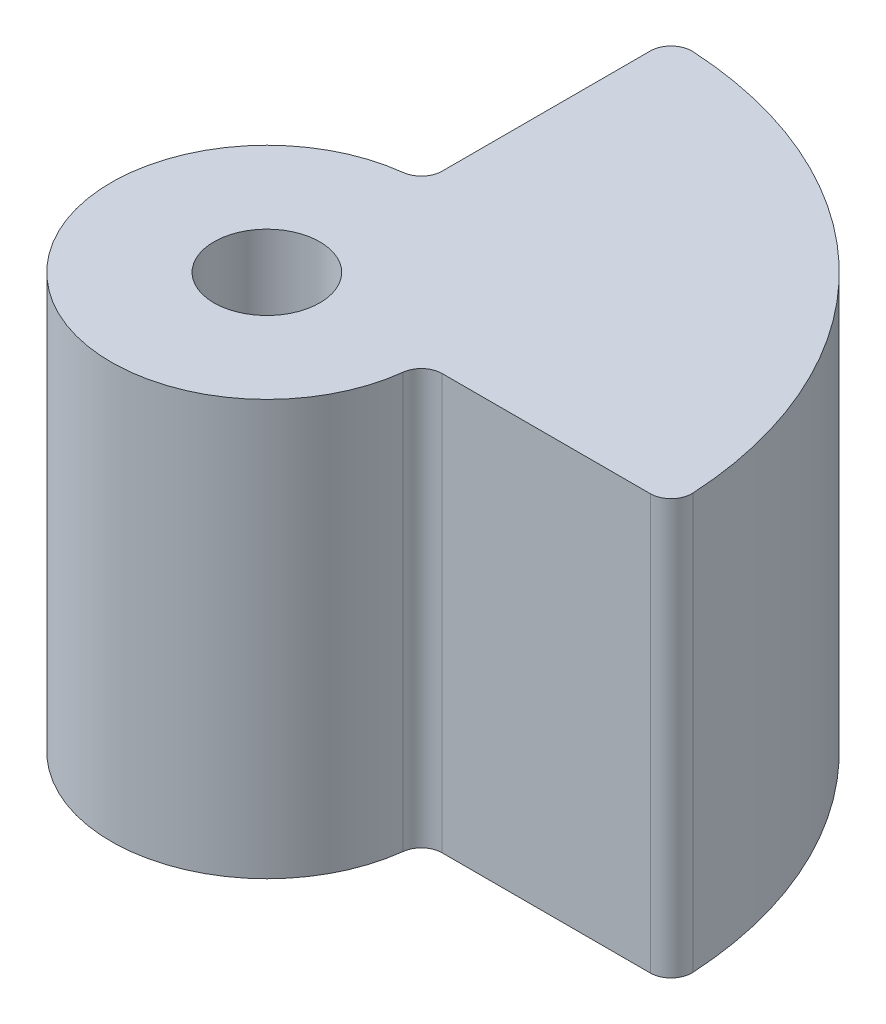
ISO-10303-21;
HEADER;
FILE_DESCRIPTION(('STEP AP214'),'2;1');
FILE_NAME('part.step','',(''),(''),'','','');
FILE_SCHEMA(('AUTOMOTIVE_DESIGN { 1 0 10303 214 1 1 1 1 }'));
ENDSEC;
DATA;
#1=APPLICATION_CONTEXT('core data for automotive mechanical design processes');
#2=APPLICATION_PROTOCOL_DEFINITION('international standard','automotive_design',2000,#1);
#3=PRODUCT_CONTEXT('',#1,'mechanical');
#4=PRODUCT('Part','Part','',(#3));
#5=PRODUCT_RELATED_PRODUCT_CATEGORY('part','',(#4));
#6=PRODUCT_DEFINITION_FORMATION('','',#4);
#7=PRODUCT_DEFINITION_CONTEXT('part definition',#1,'design');
#8=PRODUCT_DEFINITION('design','',#6,#7);
#9=PRODUCT_DEFINITION_SHAPE('','',#8);
#10=(LENGTH_UNIT() NAMED_UNIT(*) SI_UNIT(.MILLI.,.METRE.));
#11=(NAMED_UNIT(*) PLANE_ANGLE_UNIT() SI_UNIT($,.RADIAN.));
#12=(NAMED_UNIT(*) SI_UNIT($,.STERADIAN.) SOLID_ANGLE_UNIT());
#13=UNCERTAINTY_MEASURE_WITH_UNIT(LENGTH_MEASURE(1.E-05),#10,'distance_accuracy_value','');
#14=(GEOMETRIC_REPRESENTATION_CONTEXT(3) GLOBAL_UNCERTAINTY_ASSIGNED_CONTEXT((#13)) GLOBAL_UNIT_ASSIGNED_CONTEXT((#10,
#11,#12)) REPRESENTATION_CONTEXT('',''));
#15=CARTESIAN_POINT('',(0.,0.,0.));
#16=DIRECTION('',(0.,0.,1.));
#17=DIRECTION('',(1.,0.,0.));
#18=AXIS2_PLACEMENT_3D('',#15,#16,#17);
#19=CARTESIAN_POINT('',(0.,20.,0.));
#20=DIRECTION('',(0.,-1.,0.));
#21=DIRECTION('',(0.,0.,-1.));
#22=AXIS2_PLACEMENT_3D('',#19,#20,#21);
#23=CYLINDRICAL_SURFACE('',#22,7.5);
#24=CARTESIAN_POINT('',(0.,20.,0.));
#25=DIRECTION('',(0.,1.,0.));
#26=DIRECTION('',(0.,0.,1.));
#27=AXIS2_PLACEMENT_3D('',#24,#25,#26);
#28=CIRCLE('',#27,7.5);
#29=CARTESIAN_POINT('',(-0.882352941176471,20.,-7.44791603652976));
#30=VERTEX_POINT('',#29);
#31=CARTESIAN_POINT('',(7.44791603652976,20.,0.882352941176471));
#32=VERTEX_POINT('',#31);
#33=EDGE_CURVE('E134',#30,#32,#28,.T.);
#34=ORIENTED_EDGE('',*,*,#33,.F.);
#35=DIRECTION('',(0.,-1.,0.));
#36=VECTOR('',#35,1.);
#37=CARTESIAN_POINT('',(-0.882352941176471,20.,-7.44791603652976));
#38=LINE('',#37,#36);
#39=CARTESIAN_POINT('',(-0.882352941176471,0.,-7.44791603652976));
#40=VERTEX_POINT('',#39);
#41=EDGE_CURVE('E163',#30,#40,#38,.T.);
#42=ORIENTED_EDGE('',*,*,#41,.T.);
#43=CARTESIAN_POINT('',(0.,0.,0.));
#44=DIRECTION('',(0.,1.,0.));
#45=DIRECTION('',(0.,0.,1.));
#46=AXIS2_PLACEMENT_3D('',#43,#44,#45);
#47=CIRCLE('',#46,7.5);
#48=CARTESIAN_POINT('',(7.44791603652976,0.,0.882352941176471));
#49=VERTEX_POINT('',#48);
#50=EDGE_CURVE('E180',#40,#49,#47,.T.);
#51=ORIENTED_EDGE('',*,*,#50,.T.);
#52=DIRECTION('',(0.,-1.,0.));
#53=VECTOR('',#52,1.);
#54=CARTESIAN_POINT('',(7.44791603652976,20.,0.882352941176471));
#55=LINE('',#54,#53);
#56=EDGE_CURVE('E160',#49,#32,#55,.F.);
#57=ORIENTED_EDGE('',*,*,#56,.T.);
#58=EDGE_LOOP('',(#34,#42,#51,#57));
#59=FACE_BOUND('',#58,.T.);
#60=ADVANCED_FACE('F39',(#59),#23,.T.);
#61=CARTESIAN_POINT('',(7.5,20.,0.));
#62=DIRECTION('',(0.,0.,-1.));
#63=DIRECTION('',(-1.,0.,0.));
#64=AXIS2_PLACEMENT_3D('',#61,#62,#63);
#65=PLANE('',#64);
#66=DIRECTION('',(1.,0.,0.));
#67=VECTOR('',#66,1.);
#68=CARTESIAN_POINT('',(7.5,20.,0.));
#69=LINE('',#68,#67);
#70=CARTESIAN_POINT('',(8.44097150806707,20.,0.));
#71=VERTEX_POINT('',#70);
#72=CARTESIAN_POINT('',(18.4729532019112,20.,0.));
#73=VERTEX_POINT('',#72);
#74=EDGE_CURVE('E139',#71,#73,#69,.T.);
#75=ORIENTED_EDGE('',*,*,#74,.F.);
#76=DIRECTION('',(0.,1.,0.));
#77=VECTOR('',#76,1.);
#78=CARTESIAN_POINT('',(8.44097150806707,0.,0.));
#79=LINE('',#78,#77);
#80=CARTESIAN_POINT('',(8.44097150806707,0.,0.));
#81=VERTEX_POINT('',#80);
#82=EDGE_CURVE('E169',#71,#81,#79,.F.);
#83=ORIENTED_EDGE('',*,*,#82,.T.);
#84=DIRECTION('',(1.,0.,0.));
#85=VECTOR('',#84,1.);
#86=CARTESIAN_POINT('',(7.5,0.,0.));
#87=LINE('',#86,#85);
#88=CARTESIAN_POINT('',(18.4729532019112,0.,0.));
#89=VERTEX_POINT('',#88);
#90=EDGE_CURVE('E141',#81,#89,#87,.T.);
#91=ORIENTED_EDGE('',*,*,#90,.T.);
#92=DIRECTION('',(0.,-1.,0.));
#93=VECTOR('',#92,1.);
#94=CARTESIAN_POINT('',(18.4729532019112,20.,0.));
#95=LINE('',#94,#93);
#96=EDGE_CURVE('E55',#89,#73,#95,.F.);
#97=ORIENTED_EDGE('',*,*,#96,.T.);
#98=EDGE_LOOP('',(#75,#83,#91,#97));
#99=FACE_BOUND('',#98,.T.);
#100=ADVANCED_FACE('F191',(#99),#65,.F.);
#101=CARTESIAN_POINT('',(0.,20.,0.));
#102=DIRECTION('',(0.,-1.,0.));
#103=DIRECTION('',(0.,0.,-1.));
#104=AXIS2_PLACEMENT_3D('',#101,#102,#103);
#105=CYLINDRICAL_SURFACE('',#104,19.5);
#106=CARTESIAN_POINT('',(0.,0.,0.));
#107=DIRECTION('',(0.,1.,0.));
#108=DIRECTION('',(0.,0.,1.));
#109=AXIS2_PLACEMENT_3D('',#106,#107,#108);
#110=CIRCLE('',#109,19.5);
#111=CARTESIAN_POINT('',(19.4714912128253,0.,-1.05405405405405));
#112=VERTEX_POINT('',#111);
#113=CARTESIAN_POINT('',(1.05405405405405,0.,-19.4714912128253));
#114=VERTEX_POINT('',#113);
#115=EDGE_CURVE('E135',#112,#114,#110,.T.);
#116=ORIENTED_EDGE('',*,*,#115,.T.);
#117=DIRECTION('',(0.,-1.,0.));
#118=VECTOR('',#117,1.);
#119=CARTESIAN_POINT('',(1.05405405405405,20.,-19.4714912128253));
#120=LINE('',#119,#118);
#121=CARTESIAN_POINT('',(1.05405405405405,20.,-19.4714912128253));
#122=VERTEX_POINT('',#121);
#123=EDGE_CURVE('E110',#114,#122,#120,.F.);
#124=ORIENTED_EDGE('',*,*,#123,.T.);
#125=CARTESIAN_POINT('',(0.,20.,0.));
#126=DIRECTION('',(0.,1.,0.));
#127=DIRECTION('',(0.,0.,1.));
#128=AXIS2_PLACEMENT_3D('',#125,#126,#127);
#129=CIRCLE('',#128,19.5);
#130=CARTESIAN_POINT('',(19.4714912128253,20.,-1.05405405405405));
#131=VERTEX_POINT('',#130);
#132=EDGE_CURVE('E194',#131,#122,#129,.T.);
#133=ORIENTED_EDGE('',*,*,#132,.F.);
#134=DIRECTION('',(0.,-1.,0.));
#135=VECTOR('',#134,1.);
#136=CARTESIAN_POINT('',(19.4714912128253,20.,-1.05405405405405));
#137=LINE('',#136,#135);
#138=EDGE_CURVE('E116',#131,#112,#137,.T.);
#139=ORIENTED_EDGE('',*,*,#138,.T.);
#140=EDGE_LOOP('',(#116,#124,#133,#139));
#141=FACE_BOUND('',#140,.T.);
#142=ADVANCED_FACE('F219',(#141),#105,.T.);
#143=CARTESIAN_POINT('',(0.,20.,-7.5));
#144=DIRECTION('',(1.,0.,0.));
#145=DIRECTION('',(0.,0.,-1.));
#146=AXIS2_PLACEMENT_3D('',#143,#144,#145);
#147=PLANE('',#146);
#148=DIRECTION('',(0.,0.,1.));
#149=VECTOR('',#148,1.);
#150=CARTESIAN_POINT('',(0.,20.,-7.5));
#151=LINE('',#150,#149);
#152=CARTESIAN_POINT('',(0.,20.,-18.4729532019112));
#153=VERTEX_POINT('',#152);
#154=CARTESIAN_POINT('',(0.,20.,-8.44097150806707));
#155=VERTEX_POINT('',#154);
#156=EDGE_CURVE('E126',#153,#155,#151,.T.);
#157=ORIENTED_EDGE('',*,*,#156,.F.);
#158=DIRECTION('',(0.,-1.,0.));
#159=VECTOR('',#158,1.);
#160=CARTESIAN_POINT('',(0.,20.,-18.4729532019112));
#161=LINE('',#160,#159);
#162=CARTESIAN_POINT('',(0.,0.,-18.4729532019112));
#163=VERTEX_POINT('',#162);
#164=EDGE_CURVE('E109',#153,#163,#161,.T.);
#165=ORIENTED_EDGE('',*,*,#164,.T.);
#166=DIRECTION('',(0.,0.,1.));
#167=VECTOR('',#166,1.);
#168=CARTESIAN_POINT('',(0.,0.,-7.5));
#169=LINE('',#168,#167);
#170=CARTESIAN_POINT('',(0.,0.,-8.44097150806707));
#171=VERTEX_POINT('',#170);
#172=EDGE_CURVE('E123',#163,#171,#169,.T.);
#173=ORIENTED_EDGE('',*,*,#172,.T.);
#174=DIRECTION('',(0.,1.,0.));
#175=VECTOR('',#174,1.);
#176=CARTESIAN_POINT('',(0.,20.,-8.44097150806707));
#177=LINE('',#176,#175);
#178=EDGE_CURVE('E128',#171,#155,#177,.T.);
#179=ORIENTED_EDGE('',*,*,#178,.T.);
#180=EDGE_LOOP('',(#157,#165,#173,#179));
#181=FACE_BOUND('',#180,.T.);
#182=ADVANCED_FACE('F122',(#181),#147,.F.);
#183=CARTESIAN_POINT('',(0.,20.,0.));
#184=DIRECTION('',(0.,1.,0.));
#185=DIRECTION('',(0.,0.,1.));
#186=AXIS2_PLACEMENT_3D('',#183,#184,#185);
#187=PLANE('',#186);
#188=CARTESIAN_POINT('',(0.,20.,0.));
#189=DIRECTION('',(0.,1.,0.));
#190=DIRECTION('',(0.,0.,1.));
#191=AXIS2_PLACEMENT_3D('',#188,#189,#190);
#192=CIRCLE('',#191,2.55);
#193=CARTESIAN_POINT('',(0.,20.,2.55));
#194=VERTEX_POINT('',#193);
#195=EDGE_CURVE('E206',#194,#194,#192,.T.);
#196=ORIENTED_EDGE('',*,*,#195,.F.);
#197=EDGE_LOOP('',(#196));
#198=FACE_BOUND('',#197,.T.);
#199=ORIENTED_EDGE('',*,*,#132,.T.);
#200=CARTESIAN_POINT('',(1.,20.,-18.4729532019112));
#201=DIRECTION('',(0.,1.,0.));
#202=DIRECTION('',(0.,0.,1.));
#203=AXIS2_PLACEMENT_3D('',#200,#201,#202);
#204=CIRCLE('',#203,1.);
#205=EDGE_CURVE('E157',#122,#153,#204,.T.);
#206=ORIENTED_EDGE('',*,*,#205,.T.);
#207=ORIENTED_EDGE('',*,*,#156,.T.);
#208=CARTESIAN_POINT('',(-1.,20.,-8.44097150806707));
#209=DIRECTION('',(0.,1.,0.));
#210=DIRECTION('',(0.,0.,1.));
#211=AXIS2_PLACEMENT_3D('',#208,#209,#210);
#212=CIRCLE('',#211,1.);
#213=EDGE_CURVE('E175',#155,#30,#212,.F.);
#214=ORIENTED_EDGE('',*,*,#213,.T.);
#215=ORIENTED_EDGE('',*,*,#33,.T.);
#216=CARTESIAN_POINT('',(8.44097150806707,20.,1.));
#217=DIRECTION('',(0.,1.,0.));
#218=DIRECTION('',(0.,0.,1.));
#219=AXIS2_PLACEMENT_3D('',#216,#217,#218);
#220=CIRCLE('',#219,1.);
#221=EDGE_CURVE('E11',#32,#71,#220,.F.);
#222=ORIENTED_EDGE('',*,*,#221,.T.);
#223=ORIENTED_EDGE('',*,*,#74,.T.);
#224=CARTESIAN_POINT('',(18.4729532019112,20.,-1.));
#225=DIRECTION('',(0.,1.,0.));
#226=DIRECTION('',(0.,0.,1.));
#227=AXIS2_PLACEMENT_3D('',#224,#225,#226);
#228=CIRCLE('',#227,1.);
#229=EDGE_CURVE('E154',#73,#131,#228,.T.);
#230=ORIENTED_EDGE('',*,*,#229,.T.);
#231=EDGE_LOOP('',(#199,#206,#207,#214,#215,#222,#223,#230));
#232=FACE_BOUND('',#231,.T.);
#233=ADVANCED_FACE('F213',(#198,#232),#187,.T.);
#234=CARTESIAN_POINT('',(0.,0.,0.));
#235=DIRECTION('',(0.,1.,0.));
#236=DIRECTION('',(0.,0.,1.));
#237=AXIS2_PLACEMENT_3D('',#234,#235,#236);
#238=PLANE('',#237);
#239=CARTESIAN_POINT('',(0.,0.,0.));
#240=DIRECTION('',(0.,1.,0.));
#241=DIRECTION('',(0.,0.,1.));
#242=AXIS2_PLACEMENT_3D('',#239,#240,#241);
#243=CIRCLE('',#242,2.55);
#244=CARTESIAN_POINT('',(0.,0.,2.55));
#245=VERTEX_POINT('',#244);
#246=EDGE_CURVE('E188',#245,#245,#243,.T.);
#247=ORIENTED_EDGE('',*,*,#246,.T.);
#248=EDGE_LOOP('',(#247));
#249=FACE_BOUND('',#248,.T.);
#250=ORIENTED_EDGE('',*,*,#172,.F.);
#251=CARTESIAN_POINT('',(1.,0.,-18.4729532019112));
#252=DIRECTION('',(0.,1.,0.));
#253=DIRECTION('',(0.,0.,1.));
#254=AXIS2_PLACEMENT_3D('',#251,#252,#253);
#255=CIRCLE('',#254,1.);
#256=EDGE_CURVE('E105',#163,#114,#255,.F.);
#257=ORIENTED_EDGE('',*,*,#256,.T.);
#258=ORIENTED_EDGE('',*,*,#115,.F.);
#259=CARTESIAN_POINT('',(18.4729532019112,0.,-1.));
#260=DIRECTION('',(0.,1.,0.));
#261=DIRECTION('',(0.,0.,1.));
#262=AXIS2_PLACEMENT_3D('',#259,#260,#261);
#263=CIRCLE('',#262,1.);
#264=EDGE_CURVE('E117',#112,#89,#263,.F.);
#265=ORIENTED_EDGE('',*,*,#264,.T.);
#266=ORIENTED_EDGE('',*,*,#90,.F.);
#267=CARTESIAN_POINT('',(8.44097150806707,0.,1.));
#268=DIRECTION('',(0.,1.,0.));
#269=DIRECTION('',(0.,0.,1.));
#270=AXIS2_PLACEMENT_3D('',#267,#268,#269);
#271=CIRCLE('',#270,1.);
#272=EDGE_CURVE('E48',#81,#49,#271,.T.);
#273=ORIENTED_EDGE('',*,*,#272,.T.);
#274=ORIENTED_EDGE('',*,*,#50,.F.);
#275=CARTESIAN_POINT('',(-1.,0.,-8.44097150806707));
#276=DIRECTION('',(0.,1.,0.));
#277=DIRECTION('',(0.,0.,1.));
#278=AXIS2_PLACEMENT_3D('',#275,#276,#277);
#279=CIRCLE('',#278,1.);
#280=EDGE_CURVE('E132',#40,#171,#279,.T.);
#281=ORIENTED_EDGE('',*,*,#280,.T.);
#282=EDGE_LOOP('',(#250,#257,#258,#265,#266,#273,#274,#281));
#283=FACE_BOUND('',#282,.T.);
#284=ADVANCED_FACE('F130',(#249,#283),#238,.F.);
#285=CARTESIAN_POINT('',(0.,0.,0.));
#286=DIRECTION('',(0.,1.,0.));
#287=DIRECTION('',(0.,0.,1.));
#288=AXIS2_PLACEMENT_3D('',#285,#286,#287);
#289=CYLINDRICAL_SURFACE('',#288,2.55);
#290=ORIENTED_EDGE('',*,*,#246,.F.);
#291=EDGE_LOOP('',(#290));
#292=FACE_BOUND('',#291,.T.);
#293=ORIENTED_EDGE('',*,*,#195,.T.);
#294=EDGE_LOOP('',(#293));
#295=FACE_BOUND('',#294,.T.);
#296=ADVANCED_FACE('F211',(#292,#295),#289,.F.);
#297=CARTESIAN_POINT('',(1.,20.,-18.4729532019112));
#298=DIRECTION('',(0.,-1.,0.));
#299=DIRECTION('',(0.,0.,-1.));
#300=AXIS2_PLACEMENT_3D('',#297,#298,#299);
#301=CYLINDRICAL_SURFACE('',#300,1.);
#302=ORIENTED_EDGE('',*,*,#205,.F.);
#303=ORIENTED_EDGE('',*,*,#123,.F.);
#304=ORIENTED_EDGE('',*,*,#256,.F.);
#305=ORIENTED_EDGE('',*,*,#164,.F.);
#306=EDGE_LOOP('',(#302,#303,#304,#305));
#307=FACE_BOUND('',#306,.T.);
#308=ADVANCED_FACE('F108',(#307),#301,.T.);
#309=CARTESIAN_POINT('',(-1.,20.,-8.44097150806707));
#310=DIRECTION('',(0.,-1.,0.));
#311=DIRECTION('',(0.,0.,-1.));
#312=AXIS2_PLACEMENT_3D('',#309,#310,#311);
#313=CYLINDRICAL_SURFACE('',#312,1.);
#314=ORIENTED_EDGE('',*,*,#213,.F.);
#315=ORIENTED_EDGE('',*,*,#178,.F.);
#316=ORIENTED_EDGE('',*,*,#280,.F.);
#317=ORIENTED_EDGE('',*,*,#41,.F.);
#318=EDGE_LOOP('',(#314,#315,#316,#317));
#319=FACE_BOUND('',#318,.T.);
#320=ADVANCED_FACE('F225',(#319),#313,.F.);
#321=CARTESIAN_POINT('',(8.44097150806707,20.,1.));
#322=DIRECTION('',(0.,-1.,0.));
#323=DIRECTION('',(0.,0.,-1.));
#324=AXIS2_PLACEMENT_3D('',#321,#322,#323);
#325=CYLINDRICAL_SURFACE('',#324,1.);
#326=ORIENTED_EDGE('',*,*,#221,.F.);
#327=ORIENTED_EDGE('',*,*,#56,.F.);
#328=ORIENTED_EDGE('',*,*,#272,.F.);
#329=ORIENTED_EDGE('',*,*,#82,.F.);
#330=EDGE_LOOP('',(#326,#327,#328,#329));
#331=FACE_BOUND('',#330,.T.);
#332=ADVANCED_FACE('F190',(#331),#325,.F.);
#333=CARTESIAN_POINT('',(18.4729532019112,20.,-1.));
#334=DIRECTION('',(0.,-1.,0.));
#335=DIRECTION('',(0.,0.,-1.));
#336=AXIS2_PLACEMENT_3D('',#333,#334,#335);
#337=CYLINDRICAL_SURFACE('',#336,1.);
#338=ORIENTED_EDGE('',*,*,#229,.F.);
#339=ORIENTED_EDGE('',*,*,#96,.F.);
#340=ORIENTED_EDGE('',*,*,#264,.F.);
#341=ORIENTED_EDGE('',*,*,#138,.F.);
#342=EDGE_LOOP('',(#338,#339,#340,#341));
#343=FACE_BOUND('',#342,.T.);
#344=ADVANCED_FACE('F41',(#343),#337,.T.);
#345=CLOSED_SHELL('',(#60,#100,#142,#182,#233,#284,#296,#308,#320,#332,#344));
#346=MANIFOLD_SOLID_BREP('B2',#345);
#347=ADVANCED_BREP_SHAPE_REPRESENTATION('',(#18,#346),#14);
#348=SHAPE_DEFINITION_REPRESENTATION(#9,#347);
ENDSEC;
END-ISO-10303-21;
